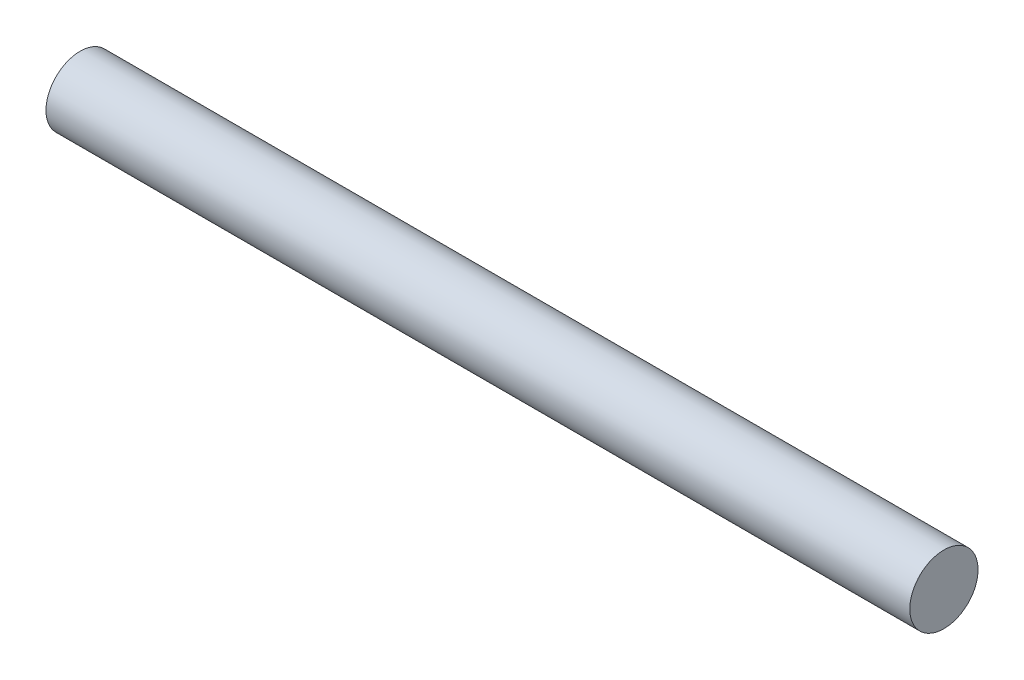
ISO-10303-21;
HEADER;
FILE_DESCRIPTION(('STEP AP214'),'2;1');
FILE_NAME('part.step','',(''),(''),'','','');
FILE_SCHEMA(('AUTOMOTIVE_DESIGN { 1 0 10303 214 1 1 1 1 }'));
ENDSEC;
DATA;
#1=APPLICATION_CONTEXT('core data for automotive mechanical design processes');
#2=APPLICATION_PROTOCOL_DEFINITION('international standard','automotive_design',2000,#1);
#3=PRODUCT_CONTEXT('',#1,'mechanical');
#4=PRODUCT('Part','Part','',(#3));
#5=PRODUCT_RELATED_PRODUCT_CATEGORY('part','',(#4));
#6=PRODUCT_DEFINITION_FORMATION('','',#4);
#7=PRODUCT_DEFINITION_CONTEXT('part definition',#1,'design');
#8=PRODUCT_DEFINITION('design','',#6,#7);
#9=PRODUCT_DEFINITION_SHAPE('','',#8);
#10=(LENGTH_UNIT() NAMED_UNIT(*) SI_UNIT(.MILLI.,.METRE.));
#11=(NAMED_UNIT(*) PLANE_ANGLE_UNIT() SI_UNIT($,.RADIAN.));
#12=(NAMED_UNIT(*) SI_UNIT($,.STERADIAN.) SOLID_ANGLE_UNIT());
#13=UNCERTAINTY_MEASURE_WITH_UNIT(LENGTH_MEASURE(1.E-05),#10,'distance_accuracy_value','');
#14=(GEOMETRIC_REPRESENTATION_CONTEXT(3) GLOBAL_UNCERTAINTY_ASSIGNED_CONTEXT((#13)) GLOBAL_UNIT_ASSIGNED_CONTEXT((#10,
#11,#12)) REPRESENTATION_CONTEXT('',''));
#15=CARTESIAN_POINT('',(0.,0.,0.));
#16=DIRECTION('',(0.,0.,1.));
#17=DIRECTION('',(1.,0.,0.));
#18=AXIS2_PLACEMENT_3D('',#15,#16,#17);
#19=CARTESIAN_POINT('',(93.,0.,0.));
#20=DIRECTION('',(-1.,0.,0.));
#21=DIRECTION('',(0.,0.,1.));
#22=AXIS2_PLACEMENT_3D('',#19,#20,#21);
#23=CYLINDRICAL_SURFACE('',#22,3.675);
#24=CARTESIAN_POINT('',(93.,0.,0.));
#25=DIRECTION('',(1.,0.,0.));
#26=DIRECTION('',(0.,0.,-1.));
#27=AXIS2_PLACEMENT_3D('',#24,#25,#26);
#28=CIRCLE('',#27,3.675);
#29=CARTESIAN_POINT('',(93.,0.,3.675));
#30=VERTEX_POINT('',#29);
#31=EDGE_CURVE('E10',#30,#30,#28,.T.);
#32=CARTESIAN_POINT('',(0.,0.,0.));
#33=DIRECTION('',(1.,0.,0.));
#34=DIRECTION('',(0.,0.,-1.));
#35=AXIS2_PLACEMENT_3D('',#32,#33,#34);
#36=CIRCLE('',#35,3.675);
#37=CARTESIAN_POINT('',(0.,0.,3.675));
#38=VERTEX_POINT('',#37);
#39=EDGE_CURVE('E37',#38,#38,#36,.T.);
#40=CARTESIAN_POINT('',(93.,0.,3.675));
#41=CARTESIAN_POINT('',(92.03125,0.,3.675));
#42=CARTESIAN_POINT('',(91.0625,0.,3.675));
#43=CARTESIAN_POINT('',(89.125,0.,3.675));
#44=CARTESIAN_POINT('',(88.15625,0.,3.675));
#45=CARTESIAN_POINT('',(86.21875,0.,3.675));
#46=CARTESIAN_POINT('',(85.25,0.,3.675));
#47=CARTESIAN_POINT('',(83.3125,0.,3.675));
#48=CARTESIAN_POINT('',(82.34375,0.,3.675));
#49=CARTESIAN_POINT('',(80.40625,0.,3.675));
#50=CARTESIAN_POINT('',(79.4375,0.,3.675));
#51=CARTESIAN_POINT('',(77.5,0.,3.675));
#52=CARTESIAN_POINT('',(76.53125,0.,3.675));
#53=CARTESIAN_POINT('',(74.59375,0.,3.675));
#54=CARTESIAN_POINT('',(73.625,0.,3.675));
#55=CARTESIAN_POINT('',(71.6875,0.,3.675));
#56=CARTESIAN_POINT('',(70.71875,0.,3.675));
#57=CARTESIAN_POINT('',(68.78125,0.,3.675));
#58=CARTESIAN_POINT('',(67.8125,0.,3.675));
#59=CARTESIAN_POINT('',(65.875,0.,3.675));
#60=CARTESIAN_POINT('',(64.90625,0.,3.675));
#61=CARTESIAN_POINT('',(62.96875,0.,3.675));
#62=CARTESIAN_POINT('',(62.,0.,3.675));
#63=CARTESIAN_POINT('',(60.0625,0.,3.675));
#64=CARTESIAN_POINT('',(59.09375,0.,3.675));
#65=CARTESIAN_POINT('',(57.15625,0.,3.675));
#66=CARTESIAN_POINT('',(56.1875,0.,3.675));
#67=CARTESIAN_POINT('',(54.25,0.,3.675));
#68=CARTESIAN_POINT('',(53.28125,0.,3.675));
#69=CARTESIAN_POINT('',(51.34375,0.,3.675));
#70=CARTESIAN_POINT('',(50.375,0.,3.675));
#71=CARTESIAN_POINT('',(48.4375,0.,3.675));
#72=CARTESIAN_POINT('',(47.46875,0.,3.675));
#73=CARTESIAN_POINT('',(45.53125,0.,3.675));
#74=CARTESIAN_POINT('',(44.5625,0.,3.675));
#75=CARTESIAN_POINT('',(42.625,0.,3.675));
#76=CARTESIAN_POINT('',(41.65625,0.,3.675));
#77=CARTESIAN_POINT('',(39.71875,0.,3.675));
#78=CARTESIAN_POINT('',(38.75,0.,3.675));
#79=CARTESIAN_POINT('',(36.8125,0.,3.675));
#80=CARTESIAN_POINT('',(35.84375,0.,3.675));
#81=CARTESIAN_POINT('',(33.90625,0.,3.675));
#82=CARTESIAN_POINT('',(32.9375,0.,3.675));
#83=CARTESIAN_POINT('',(31.,0.,3.675));
#84=CARTESIAN_POINT('',(30.03125,0.,3.675));
#85=CARTESIAN_POINT('',(28.09375,0.,3.675));
#86=CARTESIAN_POINT('',(27.125,0.,3.675));
#87=CARTESIAN_POINT('',(25.1875,0.,3.675));
#88=CARTESIAN_POINT('',(24.21875,0.,3.675));
#89=CARTESIAN_POINT('',(22.28125,0.,3.675));
#90=CARTESIAN_POINT('',(21.3125,0.,3.675));
#91=CARTESIAN_POINT('',(19.375,0.,3.675));
#92=CARTESIAN_POINT('',(18.40625,0.,3.675));
#93=CARTESIAN_POINT('',(16.46875,0.,3.675));
#94=CARTESIAN_POINT('',(15.5,0.,3.675));
#95=CARTESIAN_POINT('',(13.5625,0.,3.675));
#96=CARTESIAN_POINT('',(12.59375,0.,3.675));
#97=CARTESIAN_POINT('',(10.65625,0.,3.675));
#98=CARTESIAN_POINT('',(9.68749999999998,0.,3.675));
#99=CARTESIAN_POINT('',(7.74999999999998,0.,3.675));
#100=CARTESIAN_POINT('',(6.78124999999998,0.,3.675));
#101=CARTESIAN_POINT('',(4.84374999999998,0.,3.675));
#102=CARTESIAN_POINT('',(3.87499999999999,0.,3.675));
#103=CARTESIAN_POINT('',(1.93749999999999,0.,3.675));
#104=CARTESIAN_POINT('',(0.968749999999985,0.,3.675));
#105=CARTESIAN_POINT('',(0.,0.,3.675));
#106=B_SPLINE_CURVE_WITH_KNOTS('',3,(#40,#41,#42,#43,#44,#45,#46,#47,#48,#49,#50,#51,#52,#53,
#54,#55,#56,#57,#58,#59,#60,#61,#62,#63,#64,#65,#66,#67,#68,#69,#70,#71,#72,#73,#74,#75,#76,#77,
#78,#79,#80,#81,#82,#83,#84,#85,#86,#87,#88,#89,#90,#91,#92,#93,#94,#95,#96,#97,#98,#99,#100,
#101,#102,#103,#104,#105),.UNSPECIFIED.,.F.,.F.,(4,2,2,2,2,2,2,2,2,2,2,2,2,2,2,2,2,2,2,2,2,2,2,
2,2,2,2,2,2,2,2,2,4),(0.,2.90625000000001,5.81250000000001,8.71875000000001,11.625,14.53125,
17.4375,20.34375,23.25,26.15625,29.0625,31.96875,34.875,37.78125,40.6875,43.59375,46.5,49.40625,
52.3125,55.21875,58.125,61.03125,63.9375,66.84375,69.75,72.65625,75.5625,78.46875,81.375,
84.28125,87.1875,90.09375,93.),.UNSPECIFIED.);
#107=EDGE_CURVE('BSEAM40',#30,#38,#106,.T.);
#108=ORIENTED_EDGE('',*,*,#31,.F.);
#109=ORIENTED_EDGE('',*,*,#39,.T.);
#110=ORIENTED_EDGE('',*,*,#107,.T.);
#111=ORIENTED_EDGE('',*,*,#107,.F.);
#112=EDGE_LOOP('',(#108,#110,#109,#111));
#113=FACE_BOUND('',#112,.T.);
#114=ADVANCED_FACE('F40',(#113),#23,.T.);
#115=CARTESIAN_POINT('',(93.,0.,0.));
#116=DIRECTION('',(1.,0.,0.));
#117=DIRECTION('',(0.,0.,-1.));
#118=AXIS2_PLACEMENT_3D('',#115,#116,#117);
#119=PLANE('',#118);
#120=ORIENTED_EDGE('',*,*,#31,.T.);
#121=EDGE_LOOP('',(#120));
#122=FACE_BOUND('',#121,.T.);
#123=ADVANCED_FACE('F55',(#122),#119,.T.);
#124=CARTESIAN_POINT('',(0.,0.,0.));
#125=DIRECTION('',(1.,0.,0.));
#126=DIRECTION('',(0.,0.,-1.));
#127=AXIS2_PLACEMENT_3D('',#124,#125,#126);
#128=PLANE('',#127);
#129=ORIENTED_EDGE('',*,*,#39,.F.);
#130=EDGE_LOOP('',(#129));
#131=FACE_BOUND('',#130,.T.);
#132=ADVANCED_FACE('F49',(#131),#128,.F.);
#133=CLOSED_SHELL('',(#114,#123,#132));
#134=MANIFOLD_SOLID_BREP('B2',#133);
#135=ADVANCED_BREP_SHAPE_REPRESENTATION('',(#18,#134),#14);
#136=SHAPE_DEFINITION_REPRESENTATION(#9,#135);
ENDSEC;
END-ISO-10303-21;
